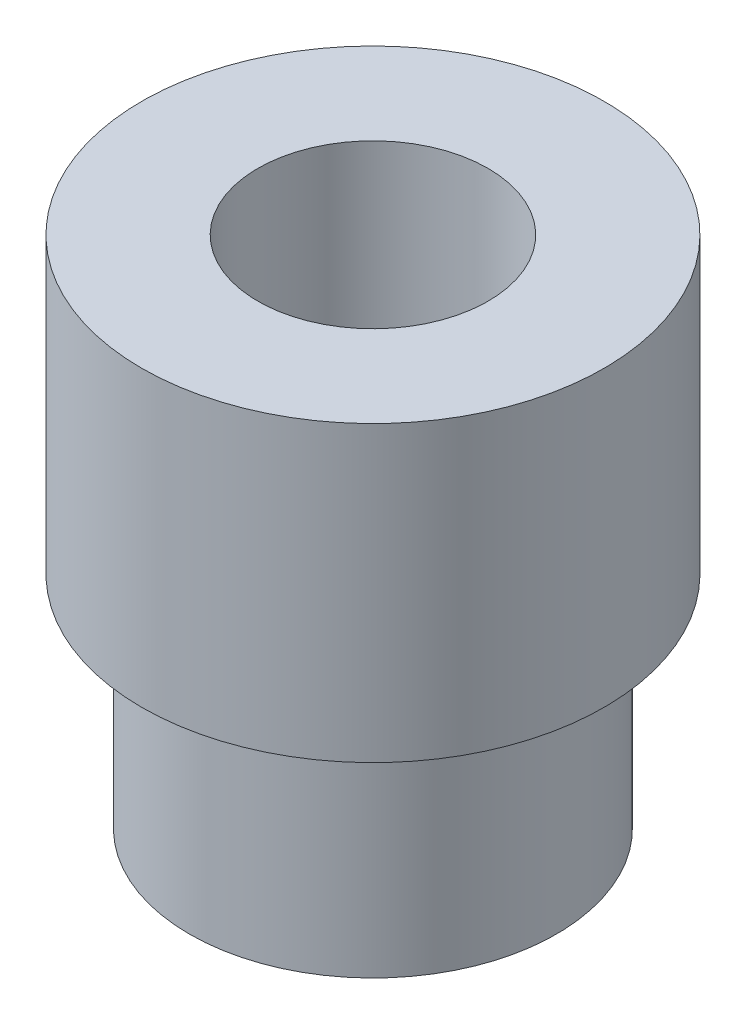
ISO-10303-21;
HEADER;
FILE_DESCRIPTION(('STEP AP214'),'2;1');
FILE_NAME('part.step','',(''),(''),'','','');
FILE_SCHEMA(('AUTOMOTIVE_DESIGN { 1 0 10303 214 1 1 1 1 }'));
ENDSEC;
DATA;
#1=APPLICATION_CONTEXT('core data for automotive mechanical design processes');
#2=APPLICATION_PROTOCOL_DEFINITION('international standard','automotive_design',2000,#1);
#3=PRODUCT_CONTEXT('',#1,'mechanical');
#4=PRODUCT('Part','Part','',(#3));
#5=PRODUCT_RELATED_PRODUCT_CATEGORY('part','',(#4));
#6=PRODUCT_DEFINITION_FORMATION('','',#4);
#7=PRODUCT_DEFINITION_CONTEXT('part definition',#1,'design');
#8=PRODUCT_DEFINITION('design','',#6,#7);
#9=PRODUCT_DEFINITION_SHAPE('','',#8);
#10=(LENGTH_UNIT() NAMED_UNIT(*) SI_UNIT(.MILLI.,.METRE.));
#11=(NAMED_UNIT(*) PLANE_ANGLE_UNIT() SI_UNIT($,.RADIAN.));
#12=(NAMED_UNIT(*) SI_UNIT($,.STERADIAN.) SOLID_ANGLE_UNIT());
#13=UNCERTAINTY_MEASURE_WITH_UNIT(LENGTH_MEASURE(1.E-05),#10,'distance_accuracy_value','');
#14=(GEOMETRIC_REPRESENTATION_CONTEXT(3) GLOBAL_UNCERTAINTY_ASSIGNED_CONTEXT((#13)) GLOBAL_UNIT_ASSIGNED_CONTEXT((#10,
#11,#12)) REPRESENTATION_CONTEXT('',''));
#15=CARTESIAN_POINT('',(0.,0.,0.));
#16=DIRECTION('',(0.,0.,1.));
#17=DIRECTION('',(1.,0.,0.));
#18=AXIS2_PLACEMENT_3D('',#15,#16,#17);
#19=CARTESIAN_POINT('',(0.,6.35,0.));
#20=DIRECTION('',(0.,-1.,0.));
#21=DIRECTION('',(0.,0.,-1.));
#22=AXIS2_PLACEMENT_3D('',#19,#20,#21);
#23=CYLINDRICAL_SURFACE('',#22,5.);
#24=CARTESIAN_POINT('',(0.,6.35,0.));
#25=DIRECTION('',(0.,1.,0.));
#26=DIRECTION('',(0.,0.,1.));
#27=AXIS2_PLACEMENT_3D('',#24,#25,#26);
#28=CIRCLE('',#27,5.);
#29=CARTESIAN_POINT('',(0.,6.35,5.));
#30=VERTEX_POINT('',#29);
#31=EDGE_CURVE('E10',#30,#30,#28,.T.);
#32=ORIENTED_EDGE('',*,*,#31,.F.);
#33=EDGE_LOOP('',(#32));
#34=FACE_BOUND('',#33,.T.);
#35=CARTESIAN_POINT('',(0.,0.,0.));
#36=DIRECTION('',(0.,1.,0.));
#37=DIRECTION('',(0.,0.,1.));
#38=AXIS2_PLACEMENT_3D('',#35,#36,#37);
#39=CIRCLE('',#38,5.);
#40=CARTESIAN_POINT('',(0.,0.,5.));
#41=VERTEX_POINT('',#40);
#42=EDGE_CURVE('E35',#41,#41,#39,.T.);
#43=ORIENTED_EDGE('',*,*,#42,.T.);
#44=EDGE_LOOP('',(#43));
#45=FACE_BOUND('',#44,.T.);
#46=ADVANCED_FACE('F32',(#34,#45),#23,.T.);
#47=CARTESIAN_POINT('',(0.,6.35,0.));
#48=DIRECTION('',(0.,1.,0.));
#49=DIRECTION('',(0.,0.,1.));
#50=AXIS2_PLACEMENT_3D('',#47,#48,#49);
#51=PLANE('',#50);
#52=CARTESIAN_POINT('',(0.,6.35,0.));
#53=DIRECTION('',(0.,-1.,0.));
#54=DIRECTION('',(0.,0.,-1.));
#55=AXIS2_PLACEMENT_3D('',#52,#53,#54);
#56=CIRCLE('',#55,2.4892);
#57=CARTESIAN_POINT('',(0.,6.35,-2.4892));
#58=VERTEX_POINT('',#57);
#59=EDGE_CURVE('E47',#58,#58,#56,.T.);
#60=ORIENTED_EDGE('',*,*,#59,.T.);
#61=EDGE_LOOP('',(#60));
#62=FACE_BOUND('',#61,.T.);
#63=ORIENTED_EDGE('',*,*,#31,.T.);
#64=EDGE_LOOP('',(#63));
#65=FACE_BOUND('',#64,.T.);
#66=ADVANCED_FACE('F73',(#62,#65),#51,.T.);
#67=CARTESIAN_POINT('',(0.,0.,0.));
#68=DIRECTION('',(0.,1.,0.));
#69=DIRECTION('',(0.,0.,1.));
#70=AXIS2_PLACEMENT_3D('',#67,#68,#69);
#71=PLANE('',#70);
#72=CARTESIAN_POINT('',(0.,0.,0.));
#73=DIRECTION('',(0.,1.,0.));
#74=DIRECTION('',(0.,0.,1.));
#75=AXIS2_PLACEMENT_3D('',#72,#73,#74);
#76=CIRCLE('',#75,3.96875);
#77=CARTESIAN_POINT('',(0.,0.,3.96875));
#78=VERTEX_POINT('',#77);
#79=EDGE_CURVE('E44',#78,#78,#76,.T.);
#80=ORIENTED_EDGE('',*,*,#79,.T.);
#81=EDGE_LOOP('',(#80));
#82=FACE_BOUND('',#81,.T.);
#83=ORIENTED_EDGE('',*,*,#42,.F.);
#84=EDGE_LOOP('',(#83));
#85=FACE_BOUND('',#84,.T.);
#86=ADVANCED_FACE('F67',(#82,#85),#71,.F.);
#87=CARTESIAN_POINT('',(0.,-4.7625,0.));
#88=DIRECTION('',(0.,1.,0.));
#89=DIRECTION('',(0.,0.,1.));
#90=AXIS2_PLACEMENT_3D('',#87,#88,#89);
#91=CYLINDRICAL_SURFACE('',#90,3.96875);
#92=CARTESIAN_POINT('',(0.,-4.7625,0.));
#93=DIRECTION('',(0.,1.,0.));
#94=DIRECTION('',(0.,0.,1.));
#95=AXIS2_PLACEMENT_3D('',#92,#93,#94);
#96=CIRCLE('',#95,3.96875);
#97=CARTESIAN_POINT('',(0.,-4.7625,3.96875));
#98=VERTEX_POINT('',#97);
#99=EDGE_CURVE('E42',#98,#98,#96,.T.);
#100=CARTESIAN_POINT('',(0.,-4.7625,3.96875));
#101=CARTESIAN_POINT('',(0.,-4.712890625,3.96875));
#102=CARTESIAN_POINT('',(0.,-4.66328125,3.96875));
#103=CARTESIAN_POINT('',(0.,-4.5640625,3.96875));
#104=CARTESIAN_POINT('',(0.,-4.514453125,3.96875));
#105=CARTESIAN_POINT('',(0.,-4.415234375,3.96875));
#106=CARTESIAN_POINT('',(0.,-4.365625,3.96875));
#107=CARTESIAN_POINT('',(0.,-4.26640625,3.96875));
#108=CARTESIAN_POINT('',(0.,-4.216796875,3.96875));
#109=CARTESIAN_POINT('',(0.,-4.117578125,3.96875));
#110=CARTESIAN_POINT('',(0.,-4.06796875,3.96875));
#111=CARTESIAN_POINT('',(0.,-3.96875,3.96875));
#112=CARTESIAN_POINT('',(0.,-3.919140625,3.96875));
#113=CARTESIAN_POINT('',(0.,-3.819921875,3.96875));
#114=CARTESIAN_POINT('',(0.,-3.7703125,3.96875));
#115=CARTESIAN_POINT('',(0.,-3.67109375,3.96875));
#116=CARTESIAN_POINT('',(0.,-3.621484375,3.96875));
#117=CARTESIAN_POINT('',(0.,-3.522265625,3.96875));
#118=CARTESIAN_POINT('',(0.,-3.47265625,3.96875));
#119=CARTESIAN_POINT('',(0.,-3.3734375,3.96875));
#120=CARTESIAN_POINT('',(0.,-3.323828125,3.96875));
#121=CARTESIAN_POINT('',(0.,-3.224609375,3.96875));
#122=CARTESIAN_POINT('',(0.,-3.175,3.96875));
#123=CARTESIAN_POINT('',(0.,-3.07578125,3.96875));
#124=CARTESIAN_POINT('',(0.,-3.026171875,3.96875));
#125=CARTESIAN_POINT('',(0.,-2.926953125,3.96875));
#126=CARTESIAN_POINT('',(0.,-2.87734375,3.96875));
#127=CARTESIAN_POINT('',(0.,-2.778125,3.96875));
#128=CARTESIAN_POINT('',(0.,-2.728515625,3.96875));
#129=CARTESIAN_POINT('',(0.,-2.629296875,3.96875));
#130=CARTESIAN_POINT('',(0.,-2.5796875,3.96875));
#131=CARTESIAN_POINT('',(0.,-2.48046875,3.96875));
#132=CARTESIAN_POINT('',(0.,-2.430859375,3.96875));
#133=CARTESIAN_POINT('',(0.,-2.331640625,3.96875));
#134=CARTESIAN_POINT('',(0.,-2.28203125,3.96875));
#135=CARTESIAN_POINT('',(0.,-2.1828125,3.96875));
#136=CARTESIAN_POINT('',(0.,-2.133203125,3.96875));
#137=CARTESIAN_POINT('',(0.,-2.033984375,3.96875));
#138=CARTESIAN_POINT('',(0.,-1.984375,3.96875));
#139=CARTESIAN_POINT('',(0.,-1.88515625,3.96875));
#140=CARTESIAN_POINT('',(0.,-1.835546875,3.96875));
#141=CARTESIAN_POINT('',(0.,-1.736328125,3.96875));
#142=CARTESIAN_POINT('',(0.,-1.68671875,3.96875));
#143=CARTESIAN_POINT('',(0.,-1.5875,3.96875));
#144=CARTESIAN_POINT('',(0.,-1.537890625,3.96875));
#145=CARTESIAN_POINT('',(0.,-1.438671875,3.96875));
#146=CARTESIAN_POINT('',(0.,-1.3890625,3.96875));
#147=CARTESIAN_POINT('',(0.,-1.28984375,3.96875));
#148=CARTESIAN_POINT('',(0.,-1.240234375,3.96875));
#149=CARTESIAN_POINT('',(0.,-1.141015625,3.96875));
#150=CARTESIAN_POINT('',(0.,-1.09140625,3.96875));
#151=CARTESIAN_POINT('',(0.,-0.9921875,3.96875));
#152=CARTESIAN_POINT('',(0.,-0.942578125,3.96875));
#153=CARTESIAN_POINT('',(0.,-0.843359375,3.96875));
#154=CARTESIAN_POINT('',(0.,-0.79375,3.96875));
#155=CARTESIAN_POINT('',(0.,-0.69453125,3.96875));
#156=CARTESIAN_POINT('',(0.,-0.644921875,3.96875));
#157=CARTESIAN_POINT('',(0.,-0.545703125,3.96875));
#158=CARTESIAN_POINT('',(0.,-0.49609375,3.96875));
#159=CARTESIAN_POINT('',(0.,-0.396875,3.96875));
#160=CARTESIAN_POINT('',(0.,-0.347265625,3.96875));
#161=CARTESIAN_POINT('',(0.,-0.248046875,3.96875));
#162=CARTESIAN_POINT('',(0.,-0.1984375,3.96875));
#163=CARTESIAN_POINT('',(0.,-0.09921875,3.96875));
#164=CARTESIAN_POINT('',(0.,-0.049609375,3.96875));
#165=CARTESIAN_POINT('',(0.,0.,3.96875));
#166=B_SPLINE_CURVE_WITH_KNOTS('',3,(#100,#101,#102,#103,#104,#105,#106,#107,#108,#109,#110,
#111,#112,#113,#114,#115,#116,#117,#118,#119,#120,#121,#122,#123,#124,#125,#126,#127,#128,#129,
#130,#131,#132,#133,#134,#135,#136,#137,#138,#139,#140,#141,#142,#143,#144,#145,#146,#147,#148,
#149,#150,#151,#152,#153,#154,#155,#156,#157,#158,#159,#160,#161,#162,#163,#164,#165),
.UNSPECIFIED.,.F.,.F.,(4,2,2,2,2,2,2,2,2,2,2,2,2,2,2,2,2,2,2,2,2,2,2,2,2,2,2,2,2,2,2,2,4),(0.,
0.148828124999999,0.297656249999999,0.446484374999999,0.595312499999999,0.744140625,0.89296875,
1.041796875,1.190625,1.339453125,1.48828125,1.637109375,1.7859375,1.934765625,2.08359375,
2.232421875,2.38125,2.530078125,2.67890625,2.827734375,2.9765625,3.125390625,3.27421875,
3.423046875,3.571875,3.720703125,3.86953125,4.018359375,4.1671875,4.316015625,4.46484375,
4.613671875,4.7625),.UNSPECIFIED.);
#167=EDGE_CURVE('BSEAM61',#98,#78,#166,.T.);
#168=ORIENTED_EDGE('',*,*,#99,.T.);
#169=ORIENTED_EDGE('',*,*,#79,.F.);
#170=ORIENTED_EDGE('',*,*,#167,.T.);
#171=ORIENTED_EDGE('',*,*,#167,.F.);
#172=EDGE_LOOP('',(#168,#170,#169,#171));
#173=FACE_BOUND('',#172,.T.);
#174=ADVANCED_FACE('F61',(#173),#91,.T.);
#175=CARTESIAN_POINT('',(0.,-4.7625,0.));
#176=DIRECTION('',(0.,1.,0.));
#177=DIRECTION('',(0.,0.,1.));
#178=AXIS2_PLACEMENT_3D('',#175,#176,#177);
#179=PLANE('',#178);
#180=CARTESIAN_POINT('',(0.,-4.7625,0.));
#181=DIRECTION('',(0.,-1.,0.));
#182=DIRECTION('',(0.,0.,-1.));
#183=AXIS2_PLACEMENT_3D('',#180,#181,#182);
#184=CIRCLE('',#183,2.4892);
#185=CARTESIAN_POINT('',(0.,-4.7625,-2.4892));
#186=VERTEX_POINT('',#185);
#187=EDGE_CURVE('E52',#186,#186,#184,.T.);
#188=ORIENTED_EDGE('',*,*,#187,.F.);
#189=EDGE_LOOP('',(#188));
#190=FACE_BOUND('',#189,.T.);
#191=ORIENTED_EDGE('',*,*,#99,.F.);
#192=EDGE_LOOP('',(#191));
#193=FACE_BOUND('',#192,.T.);
#194=ADVANCED_FACE('F58',(#190,#193),#179,.F.);
#195=CARTESIAN_POINT('',(0.,-4.7625,0.));
#196=DIRECTION('',(0.,-1.,0.));
#197=DIRECTION('',(0.,0.,-1.));
#198=AXIS2_PLACEMENT_3D('',#195,#196,#197);
#199=CYLINDRICAL_SURFACE('',#198,2.4892);
#200=ORIENTED_EDGE('',*,*,#59,.F.);
#201=EDGE_LOOP('',(#200));
#202=FACE_BOUND('',#201,.T.);
#203=ORIENTED_EDGE('',*,*,#187,.T.);
#204=EDGE_LOOP('',(#203));
#205=FACE_BOUND('',#204,.T.);
#206=ADVANCED_FACE('F56',(#202,#205),#199,.F.);
#207=CLOSED_SHELL('',(#46,#66,#86,#174,#194,#206));
#208=MANIFOLD_SOLID_BREP('B2',#207);
#209=ADVANCED_BREP_SHAPE_REPRESENTATION('',(#18,#208),#14);
#210=SHAPE_DEFINITION_REPRESENTATION(#9,#209);
ENDSEC;
END-ISO-10303-21;
